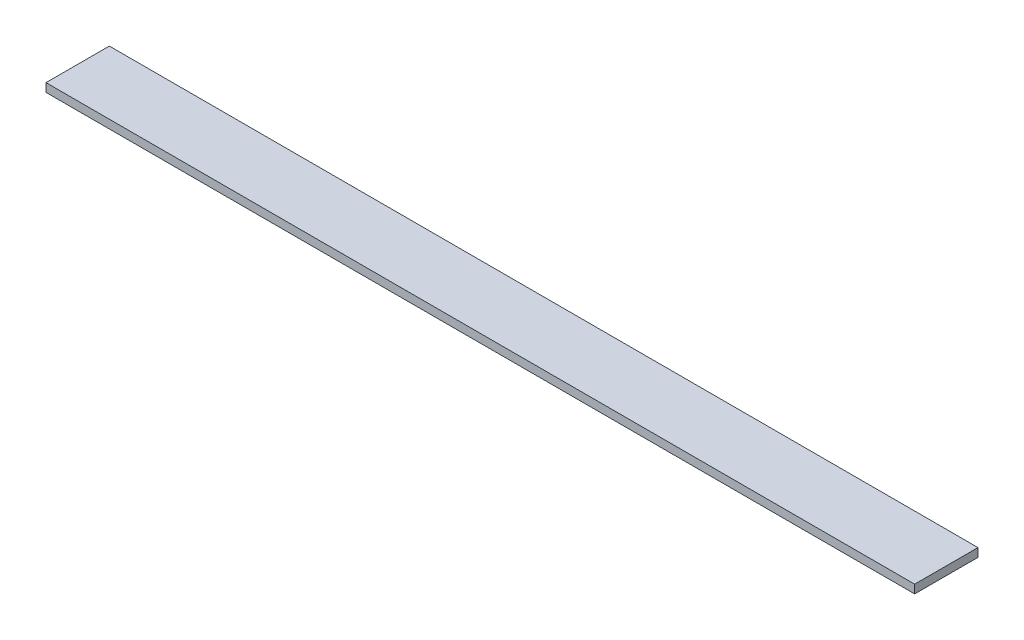
ISO-10303-21;
HEADER;
FILE_DESCRIPTION(('STEP AP214'),'2;1');
FILE_NAME('part.step','',(''),(''),'','','');
FILE_SCHEMA(('AUTOMOTIVE_DESIGN { 1 0 10303 214 1 1 1 1 }'));
ENDSEC;
DATA;
#1=APPLICATION_CONTEXT('core data for automotive mechanical design processes');
#2=APPLICATION_PROTOCOL_DEFINITION('international standard','automotive_design',2000,#1);
#3=PRODUCT_CONTEXT('',#1,'mechanical');
#4=PRODUCT('Part','Part','',(#3));
#5=PRODUCT_RELATED_PRODUCT_CATEGORY('part','',(#4));
#6=PRODUCT_DEFINITION_FORMATION('','',#4);
#7=PRODUCT_DEFINITION_CONTEXT('part definition',#1,'design');
#8=PRODUCT_DEFINITION('design','',#6,#7);
#9=PRODUCT_DEFINITION_SHAPE('','',#8);
#10=(LENGTH_UNIT() NAMED_UNIT(*) SI_UNIT(.MILLI.,.METRE.));
#11=(NAMED_UNIT(*) PLANE_ANGLE_UNIT() SI_UNIT($,.RADIAN.));
#12=(NAMED_UNIT(*) SI_UNIT($,.STERADIAN.) SOLID_ANGLE_UNIT());
#13=UNCERTAINTY_MEASURE_WITH_UNIT(LENGTH_MEASURE(1.E-05),#10,'distance_accuracy_value','');
#14=(GEOMETRIC_REPRESENTATION_CONTEXT(3) GLOBAL_UNCERTAINTY_ASSIGNED_CONTEXT((#13)) GLOBAL_UNIT_ASSIGNED_CONTEXT((#10,
#11,#12)) REPRESENTATION_CONTEXT('',''));
#15=CARTESIAN_POINT('',(0.,0.,0.));
#16=DIRECTION('',(0.,0.,1.));
#17=DIRECTION('',(1.,0.,0.));
#18=AXIS2_PLACEMENT_3D('',#15,#16,#17);
#19=CARTESIAN_POINT('',(609.6,5.953125,44.45));
#20=DIRECTION('',(-1.,0.,0.));
#21=DIRECTION('',(0.,0.,1.));
#22=AXIS2_PLACEMENT_3D('',#19,#20,#21);
#23=PLANE('',#22);
#24=DIRECTION('',(0.,0.,-1.));
#25=VECTOR('',#24,1.);
#26=CARTESIAN_POINT('',(609.6,-5.953125,44.45));
#27=LINE('',#26,#25);
#28=CARTESIAN_POINT('',(609.6,-5.953125,44.45));
#29=VERTEX_POINT('',#28);
#30=CARTESIAN_POINT('',(609.6,-5.953125,-44.45));
#31=VERTEX_POINT('',#30);
#32=EDGE_CURVE('E95',#29,#31,#27,.T.);
#33=ORIENTED_EDGE('',*,*,#32,.T.);
#34=DIRECTION('',(0.,-1.,0.));
#35=VECTOR('',#34,1.);
#36=CARTESIAN_POINT('',(609.6,5.953125,-44.45));
#37=LINE('',#36,#35);
#38=CARTESIAN_POINT('',(609.6,5.953125,-44.45));
#39=VERTEX_POINT('',#38);
#40=EDGE_CURVE('E11',#39,#31,#37,.T.);
#41=ORIENTED_EDGE('',*,*,#40,.F.);
#42=DIRECTION('',(0.,0.,-1.));
#43=VECTOR('',#42,1.);
#44=CARTESIAN_POINT('',(609.6,5.953125,44.45));
#45=LINE('',#44,#43);
#46=CARTESIAN_POINT('',(609.6,5.953125,44.45));
#47=VERTEX_POINT('',#46);
#48=EDGE_CURVE('E83',#47,#39,#45,.T.);
#49=ORIENTED_EDGE('',*,*,#48,.F.);
#50=DIRECTION('',(0.,-1.,0.));
#51=VECTOR('',#50,1.);
#52=CARTESIAN_POINT('',(609.6,5.953125,44.45));
#53=LINE('',#52,#51);
#54=EDGE_CURVE('E91',#47,#29,#53,.T.);
#55=ORIENTED_EDGE('',*,*,#54,.T.);
#56=EDGE_LOOP('',(#33,#41,#49,#55));
#57=FACE_BOUND('',#56,.T.);
#58=ADVANCED_FACE('F32',(#57),#23,.F.);
#59=CARTESIAN_POINT('',(-609.6,5.953125,-44.45));
#60=DIRECTION('',(0.,0.,1.));
#61=DIRECTION('',(1.,0.,0.));
#62=AXIS2_PLACEMENT_3D('',#59,#60,#61);
#63=PLANE('',#62);
#64=DIRECTION('',(-1.,0.,0.));
#65=VECTOR('',#64,1.);
#66=CARTESIAN_POINT('',(-609.6,-5.953125,-44.45));
#67=LINE('',#66,#65);
#68=CARTESIAN_POINT('',(-609.6,-5.953125,-44.45));
#69=VERTEX_POINT('',#68);
#70=EDGE_CURVE('E87',#31,#69,#67,.T.);
#71=ORIENTED_EDGE('',*,*,#70,.T.);
#72=DIRECTION('',(0.,-1.,0.));
#73=VECTOR('',#72,1.);
#74=CARTESIAN_POINT('',(-609.6,5.953125,-44.45));
#75=LINE('',#74,#73);
#76=CARTESIAN_POINT('',(-609.6,5.953125,-44.45));
#77=VERTEX_POINT('',#76);
#78=EDGE_CURVE('E40',#77,#69,#75,.T.);
#79=ORIENTED_EDGE('',*,*,#78,.F.);
#80=DIRECTION('',(-1.,0.,0.));
#81=VECTOR('',#80,1.);
#82=CARTESIAN_POINT('',(-609.6,5.953125,-44.45));
#83=LINE('',#82,#81);
#84=EDGE_CURVE('E78',#39,#77,#83,.T.);
#85=ORIENTED_EDGE('',*,*,#84,.F.);
#86=ORIENTED_EDGE('',*,*,#40,.T.);
#87=EDGE_LOOP('',(#71,#79,#85,#86));
#88=FACE_BOUND('',#87,.T.);
#89=ADVANCED_FACE('F86',(#88),#63,.F.);
#90=CARTESIAN_POINT('',(-609.6,5.953125,44.45));
#91=DIRECTION('',(1.,0.,0.));
#92=DIRECTION('',(0.,0.,-1.));
#93=AXIS2_PLACEMENT_3D('',#90,#91,#92);
#94=PLANE('',#93);
#95=DIRECTION('',(0.,0.,1.));
#96=VECTOR('',#95,1.);
#97=CARTESIAN_POINT('',(-609.6,-5.953125,44.45));
#98=LINE('',#97,#96);
#99=CARTESIAN_POINT('',(-609.6,-5.953125,44.45));
#100=VERTEX_POINT('',#99);
#101=EDGE_CURVE('E65',#69,#100,#98,.T.);
#102=ORIENTED_EDGE('',*,*,#101,.T.);
#103=DIRECTION('',(0.,-1.,0.));
#104=VECTOR('',#103,1.);
#105=CARTESIAN_POINT('',(-609.6,5.953125,44.45));
#106=LINE('',#105,#104);
#107=CARTESIAN_POINT('',(-609.6,5.953125,44.45));
#108=VERTEX_POINT('',#107);
#109=EDGE_CURVE('E88',#108,#100,#106,.T.);
#110=ORIENTED_EDGE('',*,*,#109,.F.);
#111=DIRECTION('',(0.,0.,1.));
#112=VECTOR('',#111,1.);
#113=CARTESIAN_POINT('',(-609.6,5.953125,44.45));
#114=LINE('',#113,#112);
#115=EDGE_CURVE('E81',#77,#108,#114,.T.);
#116=ORIENTED_EDGE('',*,*,#115,.F.);
#117=ORIENTED_EDGE('',*,*,#78,.T.);
#118=EDGE_LOOP('',(#102,#110,#116,#117));
#119=FACE_BOUND('',#118,.T.);
#120=ADVANCED_FACE('F89',(#119),#94,.F.);
#121=CARTESIAN_POINT('',(-609.6,5.953125,44.45));
#122=DIRECTION('',(0.,0.,-1.));
#123=DIRECTION('',(-1.,0.,0.));
#124=AXIS2_PLACEMENT_3D('',#121,#122,#123);
#125=PLANE('',#124);
#126=DIRECTION('',(1.,0.,0.));
#127=VECTOR('',#126,1.);
#128=CARTESIAN_POINT('',(-609.6,-5.953125,44.45));
#129=LINE('',#128,#127);
#130=EDGE_CURVE('E71',#100,#29,#129,.T.);
#131=ORIENTED_EDGE('',*,*,#130,.T.);
#132=ORIENTED_EDGE('',*,*,#54,.F.);
#133=DIRECTION('',(1.,0.,0.));
#134=VECTOR('',#133,1.);
#135=CARTESIAN_POINT('',(-609.6,5.953125,44.45));
#136=LINE('',#135,#134);
#137=EDGE_CURVE('E48',#108,#47,#136,.T.);
#138=ORIENTED_EDGE('',*,*,#137,.F.);
#139=ORIENTED_EDGE('',*,*,#109,.T.);
#140=EDGE_LOOP('',(#131,#132,#138,#139));
#141=FACE_BOUND('',#140,.T.);
#142=ADVANCED_FACE('F102',(#141),#125,.F.);
#143=CARTESIAN_POINT('',(0.,5.953125,0.));
#144=DIRECTION('',(0.,-1.,0.));
#145=DIRECTION('',(0.,0.,-1.));
#146=AXIS2_PLACEMENT_3D('',#143,#144,#145);
#147=PLANE('',#146);
#148=ORIENTED_EDGE('',*,*,#48,.T.);
#149=ORIENTED_EDGE('',*,*,#84,.T.);
#150=ORIENTED_EDGE('',*,*,#115,.T.);
#151=ORIENTED_EDGE('',*,*,#137,.T.);
#152=EDGE_LOOP('',(#148,#149,#150,#151));
#153=FACE_BOUND('',#152,.T.);
#154=ADVANCED_FACE('F79',(#153),#147,.F.);
#155=CARTESIAN_POINT('',(0.,-5.953125,0.));
#156=DIRECTION('',(0.,-1.,0.));
#157=DIRECTION('',(0.,0.,-1.));
#158=AXIS2_PLACEMENT_3D('',#155,#156,#157);
#159=PLANE('',#158);
#160=ORIENTED_EDGE('',*,*,#32,.F.);
#161=ORIENTED_EDGE('',*,*,#130,.F.);
#162=ORIENTED_EDGE('',*,*,#101,.F.);
#163=ORIENTED_EDGE('',*,*,#70,.F.);
#164=EDGE_LOOP('',(#160,#161,#162,#163));
#165=FACE_BOUND('',#164,.T.);
#166=ADVANCED_FACE('F105',(#165),#159,.T.);
#167=CLOSED_SHELL('',(#58,#89,#120,#142,#154,#166));
#168=MANIFOLD_SOLID_BREP('B2',#167);
#169=ADVANCED_BREP_SHAPE_REPRESENTATION('',(#18,#168),#14);
#170=SHAPE_DEFINITION_REPRESENTATION(#9,#169);
ENDSEC;
END-ISO-10303-21;
